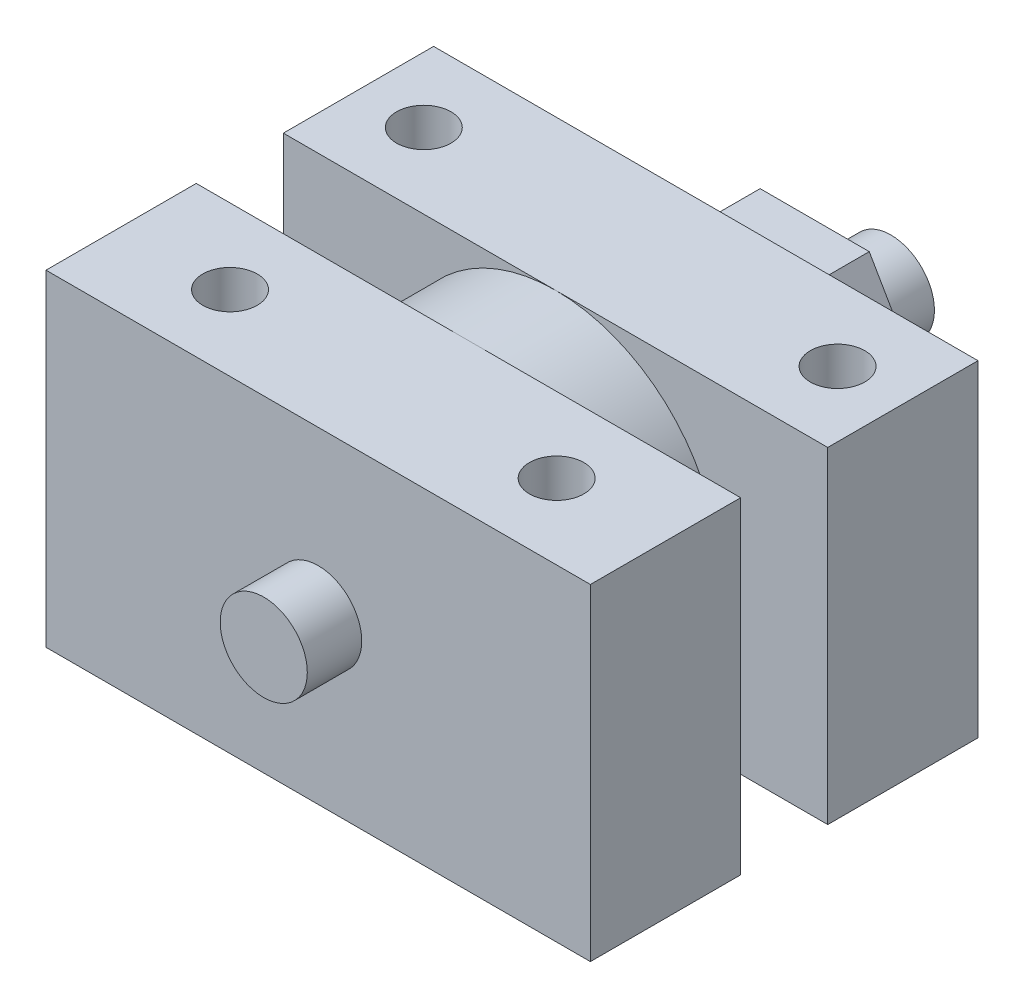
ISO-10303-21;
HEADER;
FILE_DESCRIPTION(('STEP AP214'),'2;1');
FILE_NAME('part.step','',(''),(''),'','','');
FILE_SCHEMA(('AUTOMOTIVE_DESIGN { 1 0 10303 214 1 1 1 1 }'));
ENDSEC;
DATA;
#1=APPLICATION_CONTEXT('core data for automotive mechanical design processes');
#2=APPLICATION_PROTOCOL_DEFINITION('international standard','automotive_design',2000,#1);
#3=PRODUCT_CONTEXT('',#1,'mechanical');
#4=PRODUCT('Part','Part','',(#3));
#5=PRODUCT_RELATED_PRODUCT_CATEGORY('part','',(#4));
#6=PRODUCT_DEFINITION_FORMATION('','',#4);
#7=PRODUCT_DEFINITION_CONTEXT('part definition',#1,'design');
#8=PRODUCT_DEFINITION('design','',#6,#7);
#9=PRODUCT_DEFINITION_SHAPE('','',#8);
#10=(LENGTH_UNIT() NAMED_UNIT(*) SI_UNIT(.MILLI.,.METRE.));
#11=(NAMED_UNIT(*) PLANE_ANGLE_UNIT() SI_UNIT($,.RADIAN.));
#12=(NAMED_UNIT(*) SI_UNIT($,.STERADIAN.) SOLID_ANGLE_UNIT());
#13=UNCERTAINTY_MEASURE_WITH_UNIT(LENGTH_MEASURE(1.E-05),#10,'distance_accuracy_value','');
#14=(GEOMETRIC_REPRESENTATION_CONTEXT(3) GLOBAL_UNCERTAINTY_ASSIGNED_CONTEXT((#13)) GLOBAL_UNIT_ASSIGNED_CONTEXT((#10,
#11,#12)) REPRESENTATION_CONTEXT('',''));
#15=CARTESIAN_POINT('',(0.,0.,0.));
#16=DIRECTION('',(0.,0.,1.));
#17=DIRECTION('',(1.,0.,0.));
#18=AXIS2_PLACEMENT_3D('',#15,#16,#17);
#19=CARTESIAN_POINT('',(-25.,15.,-17.8));
#20=DIRECTION('',(0.,0.,1.));
#21=DIRECTION('',(1.,0.,0.));
#22=AXIS2_PLACEMENT_3D('',#19,#20,#21);
#23=PLANE('',#22);
#24=DIRECTION('',(-1.,0.,0.));
#25=VECTOR('',#24,1.);
#26=CARTESIAN_POINT('',(-25.,-15.,-17.8));
#27=LINE('',#26,#25);
#28=CARTESIAN_POINT('',(25.,-15.,-17.8));
#29=VERTEX_POINT('',#28);
#30=CARTESIAN_POINT('',(-25.,-15.,-17.8));
#31=VERTEX_POINT('',#30);
#32=EDGE_CURVE('E265',#29,#31,#27,.T.);
#33=ORIENTED_EDGE('',*,*,#32,.T.);
#34=DIRECTION('',(0.,-1.,0.));
#35=VECTOR('',#34,1.);
#36=CARTESIAN_POINT('',(-25.,15.,-17.8));
#37=LINE('',#36,#35);
#38=CARTESIAN_POINT('',(-25.,15.,-17.8));
#39=VERTEX_POINT('',#38);
#40=EDGE_CURVE('E276',#39,#31,#37,.T.);
#41=ORIENTED_EDGE('',*,*,#40,.F.);
#42=DIRECTION('',(-1.,0.,0.));
#43=VECTOR('',#42,1.);
#44=CARTESIAN_POINT('',(-25.,15.,-17.8));
#45=LINE('',#44,#43);
#46=CARTESIAN_POINT('',(25.,15.,-17.8));
#47=VERTEX_POINT('',#46);
#48=EDGE_CURVE('E253',#47,#39,#45,.T.);
#49=ORIENTED_EDGE('',*,*,#48,.F.);
#50=DIRECTION('',(0.,-1.,0.));
#51=VECTOR('',#50,1.);
#52=CARTESIAN_POINT('',(25.,15.,-17.8));
#53=LINE('',#52,#51);
#54=EDGE_CURVE('E279',#47,#29,#53,.T.);
#55=ORIENTED_EDGE('',*,*,#54,.T.);
#56=EDGE_LOOP('',(#33,#41,#49,#55));
#57=FACE_BOUND('',#56,.T.);
#58=DIRECTION('',(0.499999999999995,-0.866025403784441,0.));
#59=VECTOR('',#58,1.);
#60=CARTESIAN_POINT('',(5.01097167882931,8.67925754302085,-17.8));
#61=LINE('',#60,#59);
#62=CARTESIAN_POINT('',(5.01097167882931,8.67925754302085,-17.8));
#63=VERTEX_POINT('',#62);
#64=CARTESIAN_POINT('',(10.0219433576584,0.,-17.8));
#65=VERTEX_POINT('',#64);
#66=EDGE_CURVE('E171',#63,#65,#61,.T.);
#67=ORIENTED_EDGE('',*,*,#66,.F.);
#68=DIRECTION('',(1.,0.,0.));
#69=VECTOR('',#68,1.);
#70=CARTESIAN_POINT('',(-5.01097167882913,8.67925754302095,-17.8));
#71=LINE('',#70,#69);
#72=CARTESIAN_POINT('',(-5.01097167882913,8.67925754302095,-17.8));
#73=VERTEX_POINT('',#72);
#74=EDGE_CURVE('E168',#73,#63,#71,.T.);
#75=ORIENTED_EDGE('',*,*,#74,.F.);
#76=DIRECTION('',(0.500000000000007,0.866025403784434,0.));
#77=VECTOR('',#76,1.);
#78=CARTESIAN_POINT('',(-10.0219433576584,0.,-17.8));
#79=LINE('',#78,#77);
#80=CARTESIAN_POINT('',(-10.0219433576584,0.,-17.8));
#81=VERTEX_POINT('',#80);
#82=EDGE_CURVE('E486',#81,#73,#79,.T.);
#83=ORIENTED_EDGE('',*,*,#82,.F.);
#84=DIRECTION('',(-0.499999999999995,0.866025403784441,0.));
#85=VECTOR('',#84,1.);
#86=CARTESIAN_POINT('',(-5.01097167882925,-8.67925754302088,-17.8));
#87=LINE('',#86,#85);
#88=CARTESIAN_POINT('',(-5.01097167882926,-8.67925754302088,-17.8));
#89=VERTEX_POINT('',#88);
#90=EDGE_CURVE('E501',#89,#81,#87,.T.);
#91=ORIENTED_EDGE('',*,*,#90,.F.);
#92=DIRECTION('',(-1.,0.,0.));
#93=VECTOR('',#92,1.);
#94=CARTESIAN_POINT('',(5.01097167882919,-8.67925754302092,-17.8));
#95=LINE('',#94,#93);
#96=CARTESIAN_POINT('',(5.01097167882919,-8.67925754302092,-17.8));
#97=VERTEX_POINT('',#96);
#98=EDGE_CURVE('E58',#97,#89,#95,.T.);
#99=ORIENTED_EDGE('',*,*,#98,.F.);
#100=DIRECTION('',(-0.500000000000001,-0.866025403784438,0.));
#101=VECTOR('',#100,1.);
#102=CARTESIAN_POINT('',(10.0219433576584,0.,-17.8));
#103=LINE('',#102,#101);
#104=EDGE_CURVE('E53',#65,#97,#103,.T.);
#105=ORIENTED_EDGE('',*,*,#104,.F.);
#106=EDGE_LOOP('',(#67,#75,#83,#91,#99,#105));
#107=FACE_BOUND('',#106,.T.);
#108=ADVANCED_FACE('F38',(#57,#107),#23,.F.);
#109=CARTESIAN_POINT('',(-25.,15.,-4.));
#110=DIRECTION('',(0.,0.,-1.));
#111=DIRECTION('',(-1.,0.,0.));
#112=AXIS2_PLACEMENT_3D('',#109,#110,#111);
#113=PLANE('',#112);
#114=CARTESIAN_POINT('',(0.,0.,-4.));
#115=DIRECTION('',(0.,0.,-1.));
#116=DIRECTION('',(-1.,0.,0.));
#117=AXIS2_PLACEMENT_3D('',#114,#115,#116);
#118=CIRCLE('',#117,15.);
#119=CARTESIAN_POINT('',(0.,-15.,-4.));
#120=VERTEX_POINT('',#119);
#121=CARTESIAN_POINT('',(0.,15.,-4.));
#122=VERTEX_POINT('',#121);
#123=EDGE_CURVE('E234',#120,#122,#118,.F.);
#124=ORIENTED_EDGE('',*,*,#123,.F.);
#125=DIRECTION('',(1.,0.,0.));
#126=VECTOR('',#125,1.);
#127=CARTESIAN_POINT('',(-25.,-15.,-4.));
#128=LINE('',#127,#126);
#129=CARTESIAN_POINT('',(25.,-15.,-4.));
#130=VERTEX_POINT('',#129);
#131=EDGE_CURVE('E269',#120,#130,#128,.T.);
#132=ORIENTED_EDGE('',*,*,#131,.T.);
#133=DIRECTION('',(0.,-1.,0.));
#134=VECTOR('',#133,1.);
#135=CARTESIAN_POINT('',(25.,15.,-4.));
#136=LINE('',#135,#134);
#137=CARTESIAN_POINT('',(25.,15.,-4.));
#138=VERTEX_POINT('',#137);
#139=EDGE_CURVE('E262',#138,#130,#136,.T.);
#140=ORIENTED_EDGE('',*,*,#139,.F.);
#141=DIRECTION('',(1.,0.,0.));
#142=VECTOR('',#141,1.);
#143=CARTESIAN_POINT('',(-25.,15.,-4.));
#144=LINE('',#143,#142);
#145=EDGE_CURVE('E258',#122,#138,#144,.T.);
#146=ORIENTED_EDGE('',*,*,#145,.F.);
#147=EDGE_LOOP('',(#124,#132,#140,#146));
#148=FACE_BOUND('',#147,.T.);
#149=ADVANCED_FACE('F307',(#148),#113,.F.);
#150=CARTESIAN_POINT('',(0.,15.,0.));
#151=DIRECTION('',(0.,1.,0.));
#152=DIRECTION('',(0.,0.,1.));
#153=AXIS2_PLACEMENT_3D('',#150,#151,#152);
#154=PLANE('',#153);
#155=CARTESIAN_POINT('',(-19.,15.,-10.9));
#156=DIRECTION('',(0.,1.,0.));
#157=DIRECTION('',(0.,0.,1.));
#158=AXIS2_PLACEMENT_3D('',#155,#156,#157);
#159=CIRCLE('',#158,2.5);
#160=CARTESIAN_POINT('',(-19.,15.,-8.4));
#161=VERTEX_POINT('',#160);
#162=EDGE_CURVE('E244',#161,#161,#159,.T.);
#163=ORIENTED_EDGE('',*,*,#162,.F.);
#164=EDGE_LOOP('',(#163));
#165=FACE_BOUND('',#164,.T.);
#166=DIRECTION('',(0.,0.,-1.));
#167=VECTOR('',#166,1.);
#168=CARTESIAN_POINT('',(25.,15.,-17.8));
#169=LINE('',#168,#167);
#170=EDGE_CURVE('E250',#138,#47,#169,.T.);
#171=ORIENTED_EDGE('',*,*,#170,.T.);
#172=ORIENTED_EDGE('',*,*,#48,.T.);
#173=DIRECTION('',(0.,0.,1.));
#174=VECTOR('',#173,1.);
#175=CARTESIAN_POINT('',(-25.,15.,-17.8));
#176=LINE('',#175,#174);
#177=CARTESIAN_POINT('',(-25.,15.,-4.));
#178=VERTEX_POINT('',#177);
#179=EDGE_CURVE('E256',#39,#178,#176,.T.);
#180=ORIENTED_EDGE('',*,*,#179,.T.);
#181=EDGE_CURVE('E259',#178,#122,#144,.T.);
#182=ORIENTED_EDGE('',*,*,#181,.T.);
#183=ORIENTED_EDGE('',*,*,#145,.T.);
#184=EDGE_LOOP('',(#171,#172,#180,#182,#183));
#185=FACE_BOUND('',#184,.T.);
#186=CARTESIAN_POINT('',(19.,15.,-10.9));
#187=DIRECTION('',(0.,1.,0.));
#188=DIRECTION('',(0.,0.,1.));
#189=AXIS2_PLACEMENT_3D('',#186,#187,#188);
#190=CIRCLE('',#189,2.5);
#191=CARTESIAN_POINT('',(19.,15.,-8.40000000000001));
#192=VERTEX_POINT('',#191);
#193=EDGE_CURVE('E238',#192,#192,#190,.T.);
#194=ORIENTED_EDGE('',*,*,#193,.F.);
#195=EDGE_LOOP('',(#194));
#196=FACE_BOUND('',#195,.T.);
#197=ADVANCED_FACE('F312',(#165,#185,#196),#154,.T.);
#198=CARTESIAN_POINT('',(0.,-15.,0.));
#199=DIRECTION('',(0.,1.,0.));
#200=DIRECTION('',(0.,0.,1.));
#201=AXIS2_PLACEMENT_3D('',#198,#199,#200);
#202=PLANE('',#201);
#203=DIRECTION('',(0.,0.,-1.));
#204=VECTOR('',#203,1.);
#205=CARTESIAN_POINT('',(25.,-15.,-17.8));
#206=LINE('',#205,#204);
#207=EDGE_CURVE('E247',#130,#29,#206,.T.);
#208=ORIENTED_EDGE('',*,*,#207,.F.);
#209=ORIENTED_EDGE('',*,*,#131,.F.);
#210=CARTESIAN_POINT('',(-25.,-15.,-4.));
#211=VERTEX_POINT('',#210);
#212=EDGE_CURVE('E254',#211,#120,#128,.T.);
#213=ORIENTED_EDGE('',*,*,#212,.F.);
#214=DIRECTION('',(0.,0.,1.));
#215=VECTOR('',#214,1.);
#216=CARTESIAN_POINT('',(-25.,-15.,-17.8));
#217=LINE('',#216,#215);
#218=EDGE_CURVE('E267',#31,#211,#217,.T.);
#219=ORIENTED_EDGE('',*,*,#218,.F.);
#220=ORIENTED_EDGE('',*,*,#32,.F.);
#221=EDGE_LOOP('',(#208,#209,#213,#219,#220));
#222=FACE_BOUND('',#221,.T.);
#223=CARTESIAN_POINT('',(-19.,-15.,-10.9));
#224=DIRECTION('',(0.,1.,0.));
#225=DIRECTION('',(0.,0.,1.));
#226=AXIS2_PLACEMENT_3D('',#223,#224,#225);
#227=CIRCLE('',#226,2.5);
#228=CARTESIAN_POINT('',(-19.,-15.,-8.4));
#229=VERTEX_POINT('',#228);
#230=EDGE_CURVE('E241',#229,#229,#227,.T.);
#231=ORIENTED_EDGE('',*,*,#230,.T.);
#232=EDGE_LOOP('',(#231));
#233=FACE_BOUND('',#232,.T.);
#234=CARTESIAN_POINT('',(19.,-15.,-10.9));
#235=DIRECTION('',(0.,1.,0.));
#236=DIRECTION('',(0.,0.,1.));
#237=AXIS2_PLACEMENT_3D('',#234,#235,#236);
#238=CIRCLE('',#237,2.5);
#239=CARTESIAN_POINT('',(19.,-15.,-8.40000000000001));
#240=VERTEX_POINT('',#239);
#241=EDGE_CURVE('E237',#240,#240,#238,.T.);
#242=ORIENTED_EDGE('',*,*,#241,.T.);
#243=EDGE_LOOP('',(#242));
#244=FACE_BOUND('',#243,.T.);
#245=ADVANCED_FACE('F324',(#222,#233,#244),#202,.F.);
#246=CARTESIAN_POINT('',(25.,15.,-17.8));
#247=DIRECTION('',(-1.,0.,0.));
#248=DIRECTION('',(0.,0.,1.));
#249=AXIS2_PLACEMENT_3D('',#246,#247,#248);
#250=PLANE('',#249);
#251=ORIENTED_EDGE('',*,*,#207,.T.);
#252=ORIENTED_EDGE('',*,*,#54,.F.);
#253=ORIENTED_EDGE('',*,*,#170,.F.);
#254=ORIENTED_EDGE('',*,*,#139,.T.);
#255=EDGE_LOOP('',(#251,#252,#253,#254));
#256=FACE_BOUND('',#255,.T.);
#257=ADVANCED_FACE('F40',(#256),#250,.F.);
#258=CARTESIAN_POINT('',(-25.,15.,-17.8));
#259=DIRECTION('',(1.,0.,0.));
#260=DIRECTION('',(0.,0.,-1.));
#261=AXIS2_PLACEMENT_3D('',#258,#259,#260);
#262=PLANE('',#261);
#263=ORIENTED_EDGE('',*,*,#218,.T.);
#264=DIRECTION('',(0.,-1.,0.));
#265=VECTOR('',#264,1.);
#266=CARTESIAN_POINT('',(-25.,15.,-4.));
#267=LINE('',#266,#265);
#268=EDGE_CURVE('E273',#178,#211,#267,.T.);
#269=ORIENTED_EDGE('',*,*,#268,.F.);
#270=ORIENTED_EDGE('',*,*,#179,.F.);
#271=ORIENTED_EDGE('',*,*,#40,.T.);
#272=EDGE_LOOP('',(#263,#269,#270,#271));
#273=FACE_BOUND('',#272,.T.);
#274=ADVANCED_FACE('F317',(#273),#262,.F.);
#275=EDGE_CURVE('E46',#122,#120,#118,.F.);
#276=ORIENTED_EDGE('',*,*,#275,.F.);
#277=ORIENTED_EDGE('',*,*,#181,.F.);
#278=ORIENTED_EDGE('',*,*,#268,.T.);
#279=ORIENTED_EDGE('',*,*,#212,.T.);
#280=EDGE_LOOP('',(#276,#277,#278,#279));
#281=FACE_BOUND('',#280,.T.);
#282=ADVANCED_FACE('F315',(#281),#113,.F.);
#283=CARTESIAN_POINT('',(-19.,15.,-10.9));
#284=DIRECTION('',(0.,-1.,0.));
#285=DIRECTION('',(0.,0.,-1.));
#286=AXIS2_PLACEMENT_3D('',#283,#284,#285);
#287=CYLINDRICAL_SURFACE('',#286,2.5);
#288=ORIENTED_EDGE('',*,*,#162,.T.);
#289=EDGE_LOOP('',(#288));
#290=FACE_BOUND('',#289,.T.);
#291=ORIENTED_EDGE('',*,*,#230,.F.);
#292=EDGE_LOOP('',(#291));
#293=FACE_BOUND('',#292,.T.);
#294=ADVANCED_FACE('F322',(#290,#293),#287,.F.);
#295=CARTESIAN_POINT('',(19.,15.,-10.9));
#296=DIRECTION('',(0.,-1.,0.));
#297=DIRECTION('',(0.,0.,-1.));
#298=AXIS2_PLACEMENT_3D('',#295,#296,#297);
#299=CYLINDRICAL_SURFACE('',#298,2.5);
#300=ORIENTED_EDGE('',*,*,#193,.T.);
#301=EDGE_LOOP('',(#300));
#302=FACE_BOUND('',#301,.T.);
#303=ORIENTED_EDGE('',*,*,#241,.F.);
#304=EDGE_LOOP('',(#303));
#305=FACE_BOUND('',#304,.T.);
#306=ADVANCED_FACE('F333',(#302,#305),#299,.F.);
#307=CARTESIAN_POINT('',(0.,0.,-17.802));
#308=DIRECTION('',(0.,0.,1.));
#309=DIRECTION('',(1.,0.,0.));
#310=AXIS2_PLACEMENT_3D('',#307,#308,#309);
#311=CYLINDRICAL_SURFACE('',#310,15.);
#312=ORIENTED_EDGE('',*,*,#123,.T.);
#313=ORIENTED_EDGE('',*,*,#275,.T.);
#314=EDGE_LOOP('',(#312,#313));
#315=FACE_BOUND('',#314,.T.);
#316=CARTESIAN_POINT('',(0.,0.,4.));
#317=DIRECTION('',(0.,0.,1.));
#318=DIRECTION('',(1.,0.,0.));
#319=AXIS2_PLACEMENT_3D('',#316,#317,#318);
#320=CIRCLE('',#319,15.);
#321=CARTESIAN_POINT('',(0.,15.,4.));
#322=VERTEX_POINT('',#321);
#323=CARTESIAN_POINT('',(0.,-15.,4.));
#324=VERTEX_POINT('',#323);
#325=EDGE_CURVE('E231',#322,#324,#320,.T.);
#326=ORIENTED_EDGE('',*,*,#325,.F.);
#327=EDGE_CURVE('E230',#324,#322,#320,.T.);
#328=ORIENTED_EDGE('',*,*,#327,.F.);
#329=EDGE_LOOP('',(#326,#328));
#330=FACE_BOUND('',#329,.T.);
#331=ADVANCED_FACE('F337',(#315,#330),#311,.T.);
#332=CARTESIAN_POINT('',(-25.,15.,4.));
#333=DIRECTION('',(0.,0.,1.));
#334=DIRECTION('',(1.,0.,0.));
#335=AXIS2_PLACEMENT_3D('',#332,#333,#334);
#336=PLANE('',#335);
#337=DIRECTION('',(-1.,0.,0.));
#338=VECTOR('',#337,1.);
#339=CARTESIAN_POINT('',(-25.,15.,4.));
#340=LINE('',#339,#338);
#341=CARTESIAN_POINT('',(-25.,15.,4.));
#342=VERTEX_POINT('',#341);
#343=EDGE_CURVE('E200',#322,#342,#340,.T.);
#344=ORIENTED_EDGE('',*,*,#343,.F.);
#345=ORIENTED_EDGE('',*,*,#325,.T.);
#346=DIRECTION('',(-1.,0.,0.));
#347=VECTOR('',#346,1.);
#348=CARTESIAN_POINT('',(-25.,-15.,4.));
#349=LINE('',#348,#347);
#350=CARTESIAN_POINT('',(-25.,-15.,4.));
#351=VERTEX_POINT('',#350);
#352=EDGE_CURVE('E212',#324,#351,#349,.T.);
#353=ORIENTED_EDGE('',*,*,#352,.T.);
#354=DIRECTION('',(0.,-1.,0.));
#355=VECTOR('',#354,1.);
#356=CARTESIAN_POINT('',(-25.,15.,4.));
#357=LINE('',#356,#355);
#358=EDGE_CURVE('E224',#342,#351,#357,.T.);
#359=ORIENTED_EDGE('',*,*,#358,.F.);
#360=EDGE_LOOP('',(#344,#345,#353,#359));
#361=FACE_BOUND('',#360,.T.);
#362=ADVANCED_FACE('F341',(#361),#336,.F.);
#363=CARTESIAN_POINT('',(25.,-15.,4.));
#364=VERTEX_POINT('',#363);
#365=EDGE_CURVE('E213',#364,#324,#349,.T.);
#366=ORIENTED_EDGE('',*,*,#365,.T.);
#367=ORIENTED_EDGE('',*,*,#327,.T.);
#368=CARTESIAN_POINT('',(25.,15.,4.));
#369=VERTEX_POINT('',#368);
#370=EDGE_CURVE('E202',#369,#322,#340,.T.);
#371=ORIENTED_EDGE('',*,*,#370,.F.);
#372=DIRECTION('',(0.,-1.,0.));
#373=VECTOR('',#372,1.);
#374=CARTESIAN_POINT('',(25.,15.,4.));
#375=LINE('',#374,#373);
#376=EDGE_CURVE('E227',#369,#364,#375,.T.);
#377=ORIENTED_EDGE('',*,*,#376,.T.);
#378=EDGE_LOOP('',(#366,#367,#371,#377));
#379=FACE_BOUND('',#378,.T.);
#380=ADVANCED_FACE('F351',(#379),#336,.F.);
#381=CARTESIAN_POINT('',(0.,15.,0.));
#382=DIRECTION('',(0.,1.,0.));
#383=DIRECTION('',(0.,0.,1.));
#384=AXIS2_PLACEMENT_3D('',#381,#382,#383);
#385=PLANE('',#384);
#386=CARTESIAN_POINT('',(15.,15.,10.9));
#387=DIRECTION('',(0.,1.,0.));
#388=DIRECTION('',(0.,0.,1.));
#389=AXIS2_PLACEMENT_3D('',#386,#387,#388);
#390=CIRCLE('',#389,2.5);
#391=CARTESIAN_POINT('',(15.,15.,13.4));
#392=VERTEX_POINT('',#391);
#393=EDGE_CURVE('E191',#392,#392,#390,.T.);
#394=ORIENTED_EDGE('',*,*,#393,.F.);
#395=EDGE_LOOP('',(#394));
#396=FACE_BOUND('',#395,.T.);
#397=DIRECTION('',(0.,0.,-1.));
#398=VECTOR('',#397,1.);
#399=CARTESIAN_POINT('',(25.,15.,4.));
#400=LINE('',#399,#398);
#401=CARTESIAN_POINT('',(25.,15.,17.8));
#402=VERTEX_POINT('',#401);
#403=EDGE_CURVE('E197',#402,#369,#400,.T.);
#404=ORIENTED_EDGE('',*,*,#403,.T.);
#405=ORIENTED_EDGE('',*,*,#370,.T.);
#406=ORIENTED_EDGE('',*,*,#343,.T.);
#407=DIRECTION('',(0.,0.,1.));
#408=VECTOR('',#407,1.);
#409=CARTESIAN_POINT('',(-25.,15.,4.));
#410=LINE('',#409,#408);
#411=CARTESIAN_POINT('',(-25.,15.,17.8));
#412=VERTEX_POINT('',#411);
#413=EDGE_CURVE('E205',#342,#412,#410,.T.);
#414=ORIENTED_EDGE('',*,*,#413,.T.);
#415=DIRECTION('',(1.,0.,0.));
#416=VECTOR('',#415,1.);
#417=CARTESIAN_POINT('',(-25.,15.,17.8));
#418=LINE('',#417,#416);
#419=EDGE_CURVE('E207',#412,#402,#418,.T.);
#420=ORIENTED_EDGE('',*,*,#419,.T.);
#421=EDGE_LOOP('',(#404,#405,#406,#414,#420));
#422=FACE_BOUND('',#421,.T.);
#423=CARTESIAN_POINT('',(-15.,15.,10.9));
#424=DIRECTION('',(0.,1.,0.));
#425=DIRECTION('',(0.,0.,1.));
#426=AXIS2_PLACEMENT_3D('',#423,#424,#425);
#427=CIRCLE('',#426,2.5);
#428=CARTESIAN_POINT('',(-15.,15.,13.4));
#429=VERTEX_POINT('',#428);
#430=EDGE_CURVE('E184',#429,#429,#427,.T.);
#431=ORIENTED_EDGE('',*,*,#430,.F.);
#432=EDGE_LOOP('',(#431));
#433=FACE_BOUND('',#432,.T.);
#434=ADVANCED_FACE('F361',(#396,#422,#433),#385,.T.);
#435=CARTESIAN_POINT('',(0.,-15.,0.));
#436=DIRECTION('',(0.,1.,0.));
#437=DIRECTION('',(0.,0.,1.));
#438=AXIS2_PLACEMENT_3D('',#435,#436,#437);
#439=PLANE('',#438);
#440=DIRECTION('',(0.,0.,-1.));
#441=VECTOR('',#440,1.);
#442=CARTESIAN_POINT('',(25.,-15.,4.));
#443=LINE('',#442,#441);
#444=CARTESIAN_POINT('',(25.,-15.,17.8));
#445=VERTEX_POINT('',#444);
#446=EDGE_CURVE('E194',#445,#364,#443,.T.);
#447=ORIENTED_EDGE('',*,*,#446,.F.);
#448=DIRECTION('',(1.,0.,0.));
#449=VECTOR('',#448,1.);
#450=CARTESIAN_POINT('',(-25.,-15.,17.8));
#451=LINE('',#450,#449);
#452=CARTESIAN_POINT('',(-25.,-15.,17.8));
#453=VERTEX_POINT('',#452);
#454=EDGE_CURVE('E201',#453,#445,#451,.T.);
#455=ORIENTED_EDGE('',*,*,#454,.F.);
#456=DIRECTION('',(0.,0.,1.));
#457=VECTOR('',#456,1.);
#458=CARTESIAN_POINT('',(-25.,-15.,4.));
#459=LINE('',#458,#457);
#460=EDGE_CURVE('E216',#351,#453,#459,.T.);
#461=ORIENTED_EDGE('',*,*,#460,.F.);
#462=ORIENTED_EDGE('',*,*,#352,.F.);
#463=ORIENTED_EDGE('',*,*,#365,.F.);
#464=EDGE_LOOP('',(#447,#455,#461,#462,#463));
#465=FACE_BOUND('',#464,.T.);
#466=CARTESIAN_POINT('',(15.,-15.,10.9));
#467=DIRECTION('',(0.,1.,0.));
#468=DIRECTION('',(0.,0.,1.));
#469=AXIS2_PLACEMENT_3D('',#466,#467,#468);
#470=CIRCLE('',#469,2.5);
#471=CARTESIAN_POINT('',(15.,-15.,13.4));
#472=VERTEX_POINT('',#471);
#473=EDGE_CURVE('E187',#472,#472,#470,.T.);
#474=ORIENTED_EDGE('',*,*,#473,.T.);
#475=EDGE_LOOP('',(#474));
#476=FACE_BOUND('',#475,.T.);
#477=CARTESIAN_POINT('',(-15.,-15.,10.9));
#478=DIRECTION('',(0.,1.,0.));
#479=DIRECTION('',(0.,0.,1.));
#480=AXIS2_PLACEMENT_3D('',#477,#478,#479);
#481=CIRCLE('',#480,2.5);
#482=CARTESIAN_POINT('',(-15.,-15.,13.4));
#483=VERTEX_POINT('',#482);
#484=EDGE_CURVE('E188',#483,#483,#481,.T.);
#485=ORIENTED_EDGE('',*,*,#484,.T.);
#486=EDGE_LOOP('',(#485));
#487=FACE_BOUND('',#486,.T.);
#488=ADVANCED_FACE('F347',(#465,#476,#487),#439,.F.);
#489=CARTESIAN_POINT('',(25.,15.,4.));
#490=DIRECTION('',(-1.,0.,0.));
#491=DIRECTION('',(0.,0.,1.));
#492=AXIS2_PLACEMENT_3D('',#489,#490,#491);
#493=PLANE('',#492);
#494=ORIENTED_EDGE('',*,*,#446,.T.);
#495=ORIENTED_EDGE('',*,*,#376,.F.);
#496=ORIENTED_EDGE('',*,*,#403,.F.);
#497=DIRECTION('',(0.,-1.,0.));
#498=VECTOR('',#497,1.);
#499=CARTESIAN_POINT('',(25.,15.,17.8));
#500=LINE('',#499,#498);
#501=EDGE_CURVE('E209',#402,#445,#500,.T.);
#502=ORIENTED_EDGE('',*,*,#501,.T.);
#503=EDGE_LOOP('',(#494,#495,#496,#502));
#504=FACE_BOUND('',#503,.T.);
#505=ADVANCED_FACE('F343',(#504),#493,.F.);
#506=CARTESIAN_POINT('',(-25.,15.,4.));
#507=DIRECTION('',(1.,0.,0.));
#508=DIRECTION('',(0.,0.,-1.));
#509=AXIS2_PLACEMENT_3D('',#506,#507,#508);
#510=PLANE('',#509);
#511=ORIENTED_EDGE('',*,*,#460,.T.);
#512=DIRECTION('',(0.,-1.,0.));
#513=VECTOR('',#512,1.);
#514=CARTESIAN_POINT('',(-25.,15.,17.8));
#515=LINE('',#514,#513);
#516=EDGE_CURVE('E221',#412,#453,#515,.T.);
#517=ORIENTED_EDGE('',*,*,#516,.F.);
#518=ORIENTED_EDGE('',*,*,#413,.F.);
#519=ORIENTED_EDGE('',*,*,#358,.T.);
#520=EDGE_LOOP('',(#511,#517,#518,#519));
#521=FACE_BOUND('',#520,.T.);
#522=ADVANCED_FACE('F346',(#521),#510,.F.);
#523=CARTESIAN_POINT('',(-25.,15.,17.8));
#524=DIRECTION('',(0.,0.,-1.));
#525=DIRECTION('',(-1.,0.,0.));
#526=AXIS2_PLACEMENT_3D('',#523,#524,#525);
#527=PLANE('',#526);
#528=CARTESIAN_POINT('',(0.,0.,17.8));
#529=DIRECTION('',(0.,0.,-1.));
#530=DIRECTION('',(-1.,0.,0.));
#531=AXIS2_PLACEMENT_3D('',#528,#529,#530);
#532=CIRCLE('',#531,4.);
#533=CARTESIAN_POINT('',(-4.,0.,17.8));
#534=VERTEX_POINT('',#533);
#535=EDGE_CURVE('E182',#534,#534,#532,.T.);
#536=ORIENTED_EDGE('',*,*,#535,.T.);
#537=EDGE_LOOP('',(#536));
#538=FACE_BOUND('',#537,.T.);
#539=ORIENTED_EDGE('',*,*,#454,.T.);
#540=ORIENTED_EDGE('',*,*,#501,.F.);
#541=ORIENTED_EDGE('',*,*,#419,.F.);
#542=ORIENTED_EDGE('',*,*,#516,.T.);
#543=EDGE_LOOP('',(#539,#540,#541,#542));
#544=FACE_BOUND('',#543,.T.);
#545=ADVANCED_FACE('F284',(#538,#544),#527,.F.);
#546=CARTESIAN_POINT('',(15.,15.,10.9));
#547=DIRECTION('',(0.,-1.,0.));
#548=DIRECTION('',(0.,0.,-1.));
#549=AXIS2_PLACEMENT_3D('',#546,#547,#548);
#550=CYLINDRICAL_SURFACE('',#549,2.5);
#551=ORIENTED_EDGE('',*,*,#393,.T.);
#552=EDGE_LOOP('',(#551));
#553=FACE_BOUND('',#552,.T.);
#554=ORIENTED_EDGE('',*,*,#473,.F.);
#555=EDGE_LOOP('',(#554));
#556=FACE_BOUND('',#555,.T.);
#557=ADVANCED_FACE('F358',(#553,#556),#550,.F.);
#558=CARTESIAN_POINT('',(-15.,15.,10.9));
#559=DIRECTION('',(0.,-1.,0.));
#560=DIRECTION('',(0.,0.,-1.));
#561=AXIS2_PLACEMENT_3D('',#558,#559,#560);
#562=CYLINDRICAL_SURFACE('',#561,2.5);
#563=ORIENTED_EDGE('',*,*,#430,.T.);
#564=EDGE_LOOP('',(#563));
#565=FACE_BOUND('',#564,.T.);
#566=ORIENTED_EDGE('',*,*,#484,.F.);
#567=EDGE_LOOP('',(#566));
#568=FACE_BOUND('',#567,.T.);
#569=ADVANCED_FACE('F298',(#565,#568),#562,.F.);
#570=CARTESIAN_POINT('',(0.,0.,22.8));
#571=DIRECTION('',(0.,0.,1.));
#572=DIRECTION('',(1.,0.,0.));
#573=AXIS2_PLACEMENT_3D('',#570,#571,#572);
#574=PLANE('',#573);
#575=CARTESIAN_POINT('',(0.,0.,22.8));
#576=DIRECTION('',(0.,0.,1.));
#577=DIRECTION('',(1.,0.,0.));
#578=AXIS2_PLACEMENT_3D('',#575,#576,#577);
#579=CIRCLE('',#578,4.);
#580=CARTESIAN_POINT('',(4.,0.,22.8));
#581=VERTEX_POINT('',#580);
#582=EDGE_CURVE('E172',#581,#581,#579,.T.);
#583=ORIENTED_EDGE('',*,*,#582,.T.);
#584=EDGE_LOOP('',(#583));
#585=FACE_BOUND('',#584,.T.);
#586=ADVANCED_FACE('F289',(#585),#574,.T.);
#587=CARTESIAN_POINT('',(0.,0.,-34.8));
#588=DIRECTION('',(0.,0.,1.));
#589=DIRECTION('',(1.,0.,0.));
#590=AXIS2_PLACEMENT_3D('',#587,#588,#589);
#591=CYLINDRICAL_SURFACE('',#590,4.);
#592=ORIENTED_EDGE('',*,*,#582,.F.);
#593=EDGE_LOOP('',(#592));
#594=FACE_BOUND('',#593,.T.);
#595=ORIENTED_EDGE('',*,*,#535,.F.);
#596=EDGE_LOOP('',(#595));
#597=FACE_BOUND('',#596,.T.);
#598=ADVANCED_FACE('F287',(#594,#597),#591,.T.);
#599=CARTESIAN_POINT('',(5.01097167882931,8.67925754302085,-27.8));
#600=DIRECTION('',(-0.866025403784442,-0.499999999999995,0.));
#601=DIRECTION('',(0.499999999999995,-0.866025403784442,0.));
#602=AXIS2_PLACEMENT_3D('',#599,#600,#601);
#603=PLANE('',#602);
#604=ORIENTED_EDGE('',*,*,#66,.T.);
#605=DIRECTION('',(0.,0.,1.));
#606=VECTOR('',#605,1.);
#607=CARTESIAN_POINT('',(10.0219433576584,0.,-27.8));
#608=LINE('',#607,#606);
#609=CARTESIAN_POINT('',(10.0219433576584,0.,-27.8));
#610=VERTEX_POINT('',#609);
#611=EDGE_CURVE('E152',#610,#65,#608,.T.);
#612=ORIENTED_EDGE('',*,*,#611,.F.);
#613=DIRECTION('',(0.499999999999995,-0.866025403784441,0.));
#614=VECTOR('',#613,1.);
#615=CARTESIAN_POINT('',(5.01097167882931,8.67925754302085,-27.8));
#616=LINE('',#615,#614);
#617=CARTESIAN_POINT('',(5.01097167882931,8.67925754302085,-27.8));
#618=VERTEX_POINT('',#617);
#619=EDGE_CURVE('E159',#618,#610,#616,.T.);
#620=ORIENTED_EDGE('',*,*,#619,.F.);
#621=DIRECTION('',(0.,0.,1.));
#622=VECTOR('',#621,1.);
#623=CARTESIAN_POINT('',(5.01097167882931,8.67925754302085,-27.8));
#624=LINE('',#623,#622);
#625=EDGE_CURVE('E482',#618,#63,#624,.T.);
#626=ORIENTED_EDGE('',*,*,#625,.T.);
#627=EDGE_LOOP('',(#604,#612,#620,#626));
#628=FACE_BOUND('',#627,.T.);
#629=ADVANCED_FACE('F170',(#628),#603,.F.);
#630=CARTESIAN_POINT('',(10.0219433576584,0.,-27.8));
#631=DIRECTION('',(-0.866025403784438,0.500000000000001,0.));
#632=DIRECTION('',(-0.500000000000001,-0.866025403784438,0.));
#633=AXIS2_PLACEMENT_3D('',#630,#631,#632);
#634=PLANE('',#633);
#635=ORIENTED_EDGE('',*,*,#104,.T.);
#636=DIRECTION('',(0.,0.,1.));
#637=VECTOR('',#636,1.);
#638=CARTESIAN_POINT('',(5.01097167882919,-8.67925754302092,-27.8));
#639=LINE('',#638,#637);
#640=CARTESIAN_POINT('',(5.01097167882919,-8.67925754302092,-27.8));
#641=VERTEX_POINT('',#640);
#642=EDGE_CURVE('E155',#641,#97,#639,.T.);
#643=ORIENTED_EDGE('',*,*,#642,.F.);
#644=DIRECTION('',(-0.500000000000001,-0.866025403784438,0.));
#645=VECTOR('',#644,1.);
#646=CARTESIAN_POINT('',(10.0219433576584,0.,-27.8));
#647=LINE('',#646,#645);
#648=EDGE_CURVE('E148',#610,#641,#647,.T.);
#649=ORIENTED_EDGE('',*,*,#648,.F.);
#650=ORIENTED_EDGE('',*,*,#611,.T.);
#651=EDGE_LOOP('',(#635,#643,#649,#650));
#652=FACE_BOUND('',#651,.T.);
#653=ADVANCED_FACE('F150',(#652),#634,.F.);
#654=CARTESIAN_POINT('',(5.01097167882919,-8.67925754302092,-27.8));
#655=DIRECTION('',(0.,1.,0.));
#656=DIRECTION('',(-1.,0.,0.));
#657=AXIS2_PLACEMENT_3D('',#654,#655,#656);
#658=PLANE('',#657);
#659=ORIENTED_EDGE('',*,*,#98,.T.);
#660=DIRECTION('',(0.,0.,1.));
#661=VECTOR('',#660,1.);
#662=CARTESIAN_POINT('',(-5.01097167882925,-8.67925754302088,-27.8));
#663=LINE('',#662,#661);
#664=CARTESIAN_POINT('',(-5.01097167882925,-8.67925754302088,-27.8));
#665=VERTEX_POINT('',#664);
#666=EDGE_CURVE('E177',#665,#89,#663,.T.);
#667=ORIENTED_EDGE('',*,*,#666,.F.);
#668=DIRECTION('',(-1.,0.,0.));
#669=VECTOR('',#668,1.);
#670=CARTESIAN_POINT('',(5.01097167882919,-8.67925754302092,-27.8));
#671=LINE('',#670,#669);
#672=EDGE_CURVE('E158',#641,#665,#671,.T.);
#673=ORIENTED_EDGE('',*,*,#672,.F.);
#674=ORIENTED_EDGE('',*,*,#642,.T.);
#675=EDGE_LOOP('',(#659,#667,#673,#674));
#676=FACE_BOUND('',#675,.T.);
#677=ADVANCED_FACE('F421',(#676),#658,.F.);
#678=CARTESIAN_POINT('',(-5.01097167882925,-8.67925754302088,-27.8));
#679=DIRECTION('',(0.866025403784442,0.499999999999995,0.));
#680=DIRECTION('',(-0.499999999999995,0.866025403784442,0.));
#681=AXIS2_PLACEMENT_3D('',#678,#679,#680);
#682=PLANE('',#681);
#683=ORIENTED_EDGE('',*,*,#90,.T.);
#684=DIRECTION('',(0.,0.,1.));
#685=VECTOR('',#684,1.);
#686=CARTESIAN_POINT('',(-10.0219433576584,0.,-27.8));
#687=LINE('',#686,#685);
#688=CARTESIAN_POINT('',(-10.0219433576584,0.,-27.8));
#689=VERTEX_POINT('',#688);
#690=EDGE_CURVE('E489',#689,#81,#687,.T.);
#691=ORIENTED_EDGE('',*,*,#690,.F.);
#692=DIRECTION('',(-0.499999999999995,0.866025403784441,0.));
#693=VECTOR('',#692,1.);
#694=CARTESIAN_POINT('',(-5.01097167882925,-8.67925754302088,-27.8));
#695=LINE('',#694,#693);
#696=EDGE_CURVE('E502',#665,#689,#695,.T.);
#697=ORIENTED_EDGE('',*,*,#696,.F.);
#698=ORIENTED_EDGE('',*,*,#666,.T.);
#699=EDGE_LOOP('',(#683,#691,#697,#698));
#700=FACE_BOUND('',#699,.T.);
#701=ADVANCED_FACE('F430',(#700),#682,.F.);
#702=CARTESIAN_POINT('',(-10.0219433576584,0.,-27.8));
#703=DIRECTION('',(0.866025403784435,-0.500000000000007,0.));
#704=DIRECTION('',(0.500000000000007,0.866025403784435,0.));
#705=AXIS2_PLACEMENT_3D('',#702,#703,#704);
#706=PLANE('',#705);
#707=ORIENTED_EDGE('',*,*,#82,.T.);
#708=DIRECTION('',(0.,0.,1.));
#709=VECTOR('',#708,1.);
#710=CARTESIAN_POINT('',(-5.01097167882913,8.67925754302095,-27.8));
#711=LINE('',#710,#709);
#712=CARTESIAN_POINT('',(-5.01097167882913,8.67925754302095,-27.8));
#713=VERTEX_POINT('',#712);
#714=EDGE_CURVE('E484',#713,#73,#711,.T.);
#715=ORIENTED_EDGE('',*,*,#714,.F.);
#716=DIRECTION('',(0.500000000000007,0.866025403784434,0.));
#717=VECTOR('',#716,1.);
#718=CARTESIAN_POINT('',(-10.0219433576584,0.,-27.8));
#719=LINE('',#718,#717);
#720=EDGE_CURVE('E491',#689,#713,#719,.T.);
#721=ORIENTED_EDGE('',*,*,#720,.F.);
#722=ORIENTED_EDGE('',*,*,#690,.T.);
#723=EDGE_LOOP('',(#707,#715,#721,#722));
#724=FACE_BOUND('',#723,.T.);
#725=ADVANCED_FACE('F440',(#724),#706,.F.);
#726=CARTESIAN_POINT('',(-5.01097167882913,8.67925754302095,-27.8));
#727=DIRECTION('',(0.,-1.,0.));
#728=DIRECTION('',(1.,0.,0.));
#729=AXIS2_PLACEMENT_3D('',#726,#727,#728);
#730=PLANE('',#729);
#731=ORIENTED_EDGE('',*,*,#74,.T.);
#732=ORIENTED_EDGE('',*,*,#625,.F.);
#733=DIRECTION('',(1.,0.,0.));
#734=VECTOR('',#733,1.);
#735=CARTESIAN_POINT('',(-5.01097167882913,8.67925754302095,-27.8));
#736=LINE('',#735,#734);
#737=EDGE_CURVE('E164',#713,#618,#736,.T.);
#738=ORIENTED_EDGE('',*,*,#737,.F.);
#739=ORIENTED_EDGE('',*,*,#714,.T.);
#740=EDGE_LOOP('',(#731,#732,#738,#739));
#741=FACE_BOUND('',#740,.T.);
#742=ADVANCED_FACE('F450',(#741),#730,.F.);
#743=CARTESIAN_POINT('',(0.,0.,-27.8));
#744=DIRECTION('',(0.,0.,-1.));
#745=DIRECTION('',(-1.,0.,0.));
#746=AXIS2_PLACEMENT_3D('',#743,#744,#745);
#747=PLANE('',#746);
#748=CARTESIAN_POINT('',(0.,0.,-27.8));
#749=DIRECTION('',(0.,0.,-1.));
#750=DIRECTION('',(-1.,0.,0.));
#751=AXIS2_PLACEMENT_3D('',#748,#749,#750);
#752=CIRCLE('',#751,4.);
#753=CARTESIAN_POINT('',(-4.,0.,-27.8));
#754=VERTEX_POINT('',#753);
#755=EDGE_CURVE('E11',#754,#754,#752,.F.);
#756=ORIENTED_EDGE('',*,*,#755,.T.);
#757=EDGE_LOOP('',(#756));
#758=FACE_BOUND('',#757,.T.);
#759=ORIENTED_EDGE('',*,*,#619,.T.);
#760=ORIENTED_EDGE('',*,*,#648,.T.);
#761=ORIENTED_EDGE('',*,*,#672,.T.);
#762=ORIENTED_EDGE('',*,*,#696,.T.);
#763=ORIENTED_EDGE('',*,*,#720,.T.);
#764=ORIENTED_EDGE('',*,*,#737,.T.);
#765=EDGE_LOOP('',(#759,#760,#761,#762,#763,#764));
#766=FACE_BOUND('',#765,.T.);
#767=ADVANCED_FACE('F162',(#758,#766),#747,.T.);
#768=CARTESIAN_POINT('',(0.,0.,-34.8));
#769=DIRECTION('',(0.,0.,1.));
#770=DIRECTION('',(1.,0.,0.));
#771=AXIS2_PLACEMENT_3D('',#768,#769,#770);
#772=PLANE('',#771);
#773=CARTESIAN_POINT('',(0.,0.,-34.8));
#774=DIRECTION('',(0.,0.,1.));
#775=DIRECTION('',(1.,0.,0.));
#776=AXIS2_PLACEMENT_3D('',#773,#774,#775);
#777=CIRCLE('',#776,4.);
#778=CARTESIAN_POINT('',(4.,0.,-34.8));
#779=VERTEX_POINT('',#778);
#780=EDGE_CURVE('E175',#779,#779,#777,.T.);
#781=ORIENTED_EDGE('',*,*,#780,.F.);
#782=EDGE_LOOP('',(#781));
#783=FACE_BOUND('',#782,.T.);
#784=ADVANCED_FACE('F304',(#783),#772,.F.);
#785=ORIENTED_EDGE('',*,*,#755,.F.);
#786=EDGE_LOOP('',(#785));
#787=FACE_BOUND('',#786,.T.);
#788=ORIENTED_EDGE('',*,*,#780,.T.);
#789=EDGE_LOOP('',(#788));
#790=FACE_BOUND('',#789,.T.);
#791=ADVANCED_FACE('F292',(#787,#790),#591,.T.);
#792=CLOSED_SHELL('',(#108,#149,#197,#245,#257,#274,#282,#294,#306,#331,#362,#380,#434,#488,
#505,#522,#545,#557,#569,#586,#598,#629,#653,#677,#701,#725,#742,#767,#784,#791));
#793=MANIFOLD_SOLID_BREP('B2',#792);
#794=ADVANCED_BREP_SHAPE_REPRESENTATION('',(#18,#793),#14);
#795=SHAPE_DEFINITION_REPRESENTATION(#9,#794);
ENDSEC;
END-ISO-10303-21;
